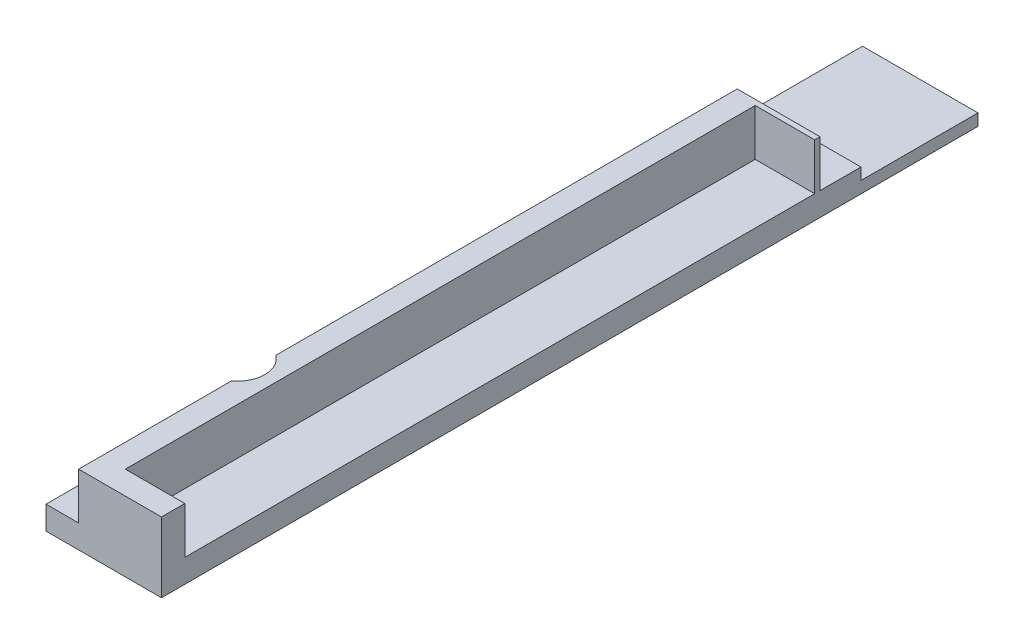
ISO-10303-21;
HEADER;
FILE_DESCRIPTION(('STEP AP214'),'2;1');
FILE_NAME('part.step','',(''),(''),'','','');
FILE_SCHEMA(('AUTOMOTIVE_DESIGN { 1 0 10303 214 1 1 1 1 }'));
ENDSEC;
DATA;
#1=APPLICATION_CONTEXT('core data for automotive mechanical design processes');
#2=APPLICATION_PROTOCOL_DEFINITION('international standard','automotive_design',2000,#1);
#3=PRODUCT_CONTEXT('',#1,'mechanical');
#4=PRODUCT('Part','Part','',(#3));
#5=PRODUCT_RELATED_PRODUCT_CATEGORY('part','',(#4));
#6=PRODUCT_DEFINITION_FORMATION('','',#4);
#7=PRODUCT_DEFINITION_CONTEXT('part definition',#1,'design');
#8=PRODUCT_DEFINITION('design','',#6,#7);
#9=PRODUCT_DEFINITION_SHAPE('','',#8);
#10=(LENGTH_UNIT() NAMED_UNIT(*) SI_UNIT(.MILLI.,.METRE.));
#11=(NAMED_UNIT(*) PLANE_ANGLE_UNIT() SI_UNIT($,.RADIAN.));
#12=(NAMED_UNIT(*) SI_UNIT($,.STERADIAN.) SOLID_ANGLE_UNIT());
#13=UNCERTAINTY_MEASURE_WITH_UNIT(LENGTH_MEASURE(1.E-05),#10,'distance_accuracy_value','');
#14=(GEOMETRIC_REPRESENTATION_CONTEXT(3) GLOBAL_UNCERTAINTY_ASSIGNED_CONTEXT((#13)) GLOBAL_UNIT_ASSIGNED_CONTEXT((#10,
#11,#12)) REPRESENTATION_CONTEXT('',''));
#15=CARTESIAN_POINT('',(0.,0.,0.));
#16=DIRECTION('',(0.,0.,1.));
#17=DIRECTION('',(1.,0.,0.));
#18=AXIS2_PLACEMENT_3D('',#15,#16,#17);
#19=CARTESIAN_POINT('',(-38.481,15.24,0.));
#20=DIRECTION('',(-1.,0.,0.));
#21=DIRECTION('',(0.,0.,1.));
#22=AXIS2_PLACEMENT_3D('',#19,#20,#21);
#23=PLANE('',#22);
#24=DIRECTION('',(0.,0.,-1.));
#25=VECTOR('',#24,1.);
#26=CARTESIAN_POINT('',(-38.481,5.08,0.));
#27=LINE('',#26,#25);
#28=CARTESIAN_POINT('',(-38.481,5.08,80.7048732037143));
#29=VERTEX_POINT('',#28);
#30=CARTESIAN_POINT('',(-38.481,5.08,-19.7685976203883));
#31=VERTEX_POINT('',#30);
#32=EDGE_CURVE('E187',#29,#31,#27,.T.);
#33=ORIENTED_EDGE('',*,*,#32,.F.);
#34=DIRECTION('',(0.,-1.,0.));
#35=VECTOR('',#34,1.);
#36=CARTESIAN_POINT('',(-38.481,21.59,80.7048732037143));
#37=LINE('',#36,#35);
#38=CARTESIAN_POINT('',(-38.481,15.24,80.7048732037143));
#39=VERTEX_POINT('',#38);
#40=EDGE_CURVE('E164',#29,#39,#37,.F.);
#41=ORIENTED_EDGE('',*,*,#40,.T.);
#42=DIRECTION('',(0.,0.,-1.));
#43=VECTOR('',#42,1.);
#44=CARTESIAN_POINT('',(-38.481,15.24,0.));
#45=LINE('',#44,#43);
#46=CARTESIAN_POINT('',(-38.481,15.24,-19.7685976203883));
#47=VERTEX_POINT('',#46);
#48=EDGE_CURVE('E210',#39,#47,#45,.T.);
#49=ORIENTED_EDGE('',*,*,#48,.T.);
#50=DIRECTION('',(0.,-1.,0.));
#51=VECTOR('',#50,1.);
#52=CARTESIAN_POINT('',(-38.481,15.24,-19.7685976203883));
#53=LINE('',#52,#51);
#54=EDGE_CURVE('E211',#47,#31,#53,.T.);
#55=ORIENTED_EDGE('',*,*,#54,.T.);
#56=EDGE_LOOP('',(#33,#41,#49,#55));
#57=FACE_BOUND('',#56,.T.);
#58=ADVANCED_FACE('F56',(#57),#23,.T.);
#59=CARTESIAN_POINT('',(-38.481,15.24,123.637560240964));
#60=VERTEX_POINT('',#59);
#61=CARTESIAN_POINT('',(-38.481,15.24,90.3702472782134));
#62=VERTEX_POINT('',#61);
#63=EDGE_CURVE('E177',#60,#62,#45,.T.);
#64=ORIENTED_EDGE('',*,*,#63,.T.);
#65=DIRECTION('',(0.,-1.,0.));
#66=VECTOR('',#65,1.);
#67=CARTESIAN_POINT('',(-38.481,21.59,90.3702472782134));
#68=LINE('',#67,#66);
#69=CARTESIAN_POINT('',(-38.481,5.08,90.3702472782134));
#70=VERTEX_POINT('',#69);
#71=EDGE_CURVE('E72',#62,#70,#68,.T.);
#72=ORIENTED_EDGE('',*,*,#71,.T.);
#73=CARTESIAN_POINT('',(-38.481,5.08,123.637560240964));
#74=VERTEX_POINT('',#73);
#75=EDGE_CURVE('E175',#74,#70,#27,.T.);
#76=ORIENTED_EDGE('',*,*,#75,.F.);
#77=DIRECTION('',(0.,-1.,0.));
#78=VECTOR('',#77,1.);
#79=CARTESIAN_POINT('',(-38.481,15.24,123.637560240964));
#80=LINE('',#79,#78);
#81=EDGE_CURVE('E235',#60,#74,#80,.T.);
#82=ORIENTED_EDGE('',*,*,#81,.F.);
#83=EDGE_LOOP('',(#64,#72,#76,#82));
#84=FACE_BOUND('',#83,.T.);
#85=ADVANCED_FACE('F174',(#84),#23,.T.);
#86=CARTESIAN_POINT('',(-20.447,5.08,-54.1624397590361));
#87=DIRECTION('',(0.,0.,1.));
#88=DIRECTION('',(1.,0.,0.));
#89=AXIS2_PLACEMENT_3D('',#86,#87,#88);
#90=PLANE('',#89);
#91=DIRECTION('',(-1.,0.,0.));
#92=VECTOR('',#91,1.);
#93=CARTESIAN_POINT('',(-45.593,2.54,-54.1624397590361));
#94=LINE('',#93,#92);
#95=CARTESIAN_POINT('',(-20.447,2.54,-54.1624397590361));
#96=VERTEX_POINT('',#95);
#97=CARTESIAN_POINT('',(-45.593,2.54,-54.1624397590361));
#98=VERTEX_POINT('',#97);
#99=EDGE_CURVE('E281',#96,#98,#94,.T.);
#100=ORIENTED_EDGE('',*,*,#99,.F.);
#101=DIRECTION('',(0.,-1.,0.));
#102=VECTOR('',#101,1.);
#103=CARTESIAN_POINT('',(-20.447,5.08,-54.1624397590361));
#104=LINE('',#103,#102);
#105=CARTESIAN_POINT('',(-20.447,0.,-54.1624397590361));
#106=VERTEX_POINT('',#105);
#107=EDGE_CURVE('E65',#96,#106,#104,.T.);
#108=ORIENTED_EDGE('',*,*,#107,.T.);
#109=DIRECTION('',(-1.,0.,0.));
#110=VECTOR('',#109,1.);
#111=CARTESIAN_POINT('',(-20.447,0.,-54.1624397590361));
#112=LINE('',#111,#110);
#113=CARTESIAN_POINT('',(-45.593,0.,-54.1624397590361));
#114=VERTEX_POINT('',#113);
#115=EDGE_CURVE('E254',#106,#114,#112,.T.);
#116=ORIENTED_EDGE('',*,*,#115,.T.);
#117=DIRECTION('',(0.,-1.,0.));
#118=VECTOR('',#117,1.);
#119=CARTESIAN_POINT('',(-45.593,5.08,-54.1624397590361));
#120=LINE('',#119,#118);
#121=EDGE_CURVE('E270',#98,#114,#120,.T.);
#122=ORIENTED_EDGE('',*,*,#121,.F.);
#123=EDGE_LOOP('',(#100,#108,#116,#122));
#124=FACE_BOUND('',#123,.T.);
#125=ADVANCED_FACE('F278',(#124),#90,.F.);
#126=CARTESIAN_POINT('',(0.,5.08,0.));
#127=DIRECTION('',(0.,-1.,0.));
#128=DIRECTION('',(0.,0.,-1.));
#129=AXIS2_PLACEMENT_3D('',#126,#127,#128);
#130=PLANE('',#129);
#131=DIRECTION('',(1.,0.,0.));
#132=VECTOR('',#131,1.);
#133=CARTESIAN_POINT('',(0.,5.08,-18.6024397590361));
#134=LINE('',#133,#132);
#135=CARTESIAN_POINT('',(-33.401,5.08,-18.6024397590361));
#136=VERTEX_POINT('',#135);
#137=CARTESIAN_POINT('',(-20.447,5.08,-18.6024397590361));
#138=VERTEX_POINT('',#137);
#139=EDGE_CURVE('E203',#136,#138,#134,.T.);
#140=ORIENTED_EDGE('',*,*,#139,.F.);
#141=DIRECTION('',(0.,0.,-1.));
#142=VECTOR('',#141,1.);
#143=CARTESIAN_POINT('',(-33.401,5.08,0.));
#144=LINE('',#143,#142);
#145=CARTESIAN_POINT('',(-33.401,5.08,118.557560240964));
#146=VERTEX_POINT('',#145);
#147=EDGE_CURVE('E193',#146,#136,#144,.T.);
#148=ORIENTED_EDGE('',*,*,#147,.F.);
#149=DIRECTION('',(-1.,0.,0.));
#150=VECTOR('',#149,1.);
#151=CARTESIAN_POINT('',(0.,5.08,118.557560240964));
#152=LINE('',#151,#150);
#153=CARTESIAN_POINT('',(-20.447,5.08,118.557560240964));
#154=VERTEX_POINT('',#153);
#155=EDGE_CURVE('E186',#154,#146,#152,.T.);
#156=ORIENTED_EDGE('',*,*,#155,.F.);
#157=DIRECTION('',(0.,0.,-1.));
#158=VECTOR('',#157,1.);
#159=CARTESIAN_POINT('',(-20.447,5.08,-54.1624397590361));
#160=LINE('',#159,#158);
#161=EDGE_CURVE('E243',#154,#138,#160,.T.);
#162=ORIENTED_EDGE('',*,*,#161,.T.);
#163=EDGE_LOOP('',(#140,#148,#156,#162));
#164=FACE_BOUND('',#163,.T.);
#165=ADVANCED_FACE('F424',(#164),#130,.F.);
#166=CARTESIAN_POINT('',(-20.447,5.08,-54.1624397590361));
#167=DIRECTION('',(-1.,0.,0.));
#168=DIRECTION('',(0.,0.,1.));
#169=AXIS2_PLACEMENT_3D('',#166,#167,#168);
#170=PLANE('',#169);
#171=DIRECTION('',(0.,0.,-1.));
#172=VECTOR('',#171,1.);
#173=CARTESIAN_POINT('',(-20.447,2.54,-54.1624397590361));
#174=LINE('',#173,#172);
#175=CARTESIAN_POINT('',(-20.447,2.54,-28.676603854416));
#176=VERTEX_POINT('',#175);
#177=EDGE_CURVE('E361',#176,#96,#174,.T.);
#178=ORIENTED_EDGE('',*,*,#177,.F.);
#179=DIRECTION('',(0.,1.,0.));
#180=VECTOR('',#179,1.);
#181=CARTESIAN_POINT('',(-20.447,2.54,-28.676603854416));
#182=LINE('',#181,#180);
#183=CARTESIAN_POINT('',(-20.447,5.08,-28.676603854416));
#184=VERTEX_POINT('',#183);
#185=EDGE_CURVE('E195',#176,#184,#182,.T.);
#186=ORIENTED_EDGE('',*,*,#185,.T.);
#187=CARTESIAN_POINT('',(-20.447,5.08,-19.7685976203883));
#188=VERTEX_POINT('',#187);
#189=EDGE_CURVE('E239',#188,#184,#160,.T.);
#190=ORIENTED_EDGE('',*,*,#189,.F.);
#191=DIRECTION('',(0.,-1.,0.));
#192=VECTOR('',#191,1.);
#193=CARTESIAN_POINT('',(-20.447,15.24,-19.7685976203883));
#194=LINE('',#193,#192);
#195=CARTESIAN_POINT('',(-20.447,15.24,-19.7685976203883));
#196=VERTEX_POINT('',#195);
#197=EDGE_CURVE('E215',#196,#188,#194,.T.);
#198=ORIENTED_EDGE('',*,*,#197,.F.);
#199=DIRECTION('',(0.,0.,-1.));
#200=VECTOR('',#199,1.);
#201=CARTESIAN_POINT('',(-20.447,15.24,0.));
#202=LINE('',#201,#200);
#203=CARTESIAN_POINT('',(-20.447,15.24,-18.6024397590361));
#204=VERTEX_POINT('',#203);
#205=EDGE_CURVE('E316',#204,#196,#202,.T.);
#206=ORIENTED_EDGE('',*,*,#205,.F.);
#207=DIRECTION('',(0.,-1.,0.));
#208=VECTOR('',#207,1.);
#209=CARTESIAN_POINT('',(-20.447,15.24,-18.6024397590361));
#210=LINE('',#209,#208);
#211=EDGE_CURVE('E219',#204,#138,#210,.T.);
#212=ORIENTED_EDGE('',*,*,#211,.T.);
#213=ORIENTED_EDGE('',*,*,#161,.F.);
#214=DIRECTION('',(0.,-1.,0.));
#215=VECTOR('',#214,1.);
#216=CARTESIAN_POINT('',(-20.447,15.24,118.557560240964));
#217=LINE('',#216,#215);
#218=CARTESIAN_POINT('',(-20.447,15.24,118.557560240964));
#219=VERTEX_POINT('',#218);
#220=EDGE_CURVE('E231',#219,#154,#217,.T.);
#221=ORIENTED_EDGE('',*,*,#220,.F.);
#222=DIRECTION('',(0.,0.,-1.));
#223=VECTOR('',#222,1.);
#224=CARTESIAN_POINT('',(-20.447,15.24,0.));
#225=LINE('',#224,#223);
#226=CARTESIAN_POINT('',(-20.447,15.24,123.637560240964));
#227=VERTEX_POINT('',#226);
#228=EDGE_CURVE('E290',#227,#219,#225,.T.);
#229=ORIENTED_EDGE('',*,*,#228,.F.);
#230=DIRECTION('',(0.,-1.,0.));
#231=VECTOR('',#230,1.);
#232=CARTESIAN_POINT('',(-20.447,5.08,123.637560240964));
#233=LINE('',#232,#231);
#234=CARTESIAN_POINT('',(-20.447,0.,123.637560240964));
#235=VERTEX_POINT('',#234);
#236=EDGE_CURVE('E250',#227,#235,#233,.T.);
#237=ORIENTED_EDGE('',*,*,#236,.T.);
#238=DIRECTION('',(0.,0.,-1.));
#239=VECTOR('',#238,1.);
#240=CARTESIAN_POINT('',(-20.447,0.,-54.1624397590361));
#241=LINE('',#240,#239);
#242=EDGE_CURVE('E238',#235,#106,#241,.T.);
#243=ORIENTED_EDGE('',*,*,#242,.T.);
#244=ORIENTED_EDGE('',*,*,#107,.F.);
#245=EDGE_LOOP('',(#178,#186,#190,#198,#206,#212,#213,#221,#229,#237,#243,#244));
#246=FACE_BOUND('',#245,.T.);
#247=ADVANCED_FACE('F58',(#246),#170,.F.);
#248=CARTESIAN_POINT('',(-45.593,5.08,-54.1624397590361));
#249=DIRECTION('',(1.,0.,0.));
#250=DIRECTION('',(0.,0.,-1.));
#251=AXIS2_PLACEMENT_3D('',#248,#249,#250);
#252=PLANE('',#251);
#253=DIRECTION('',(0.,0.,1.));
#254=VECTOR('',#253,1.);
#255=CARTESIAN_POINT('',(-45.593,5.08,-54.1624397590361));
#256=LINE('',#255,#254);
#257=CARTESIAN_POINT('',(-45.593,5.08,-28.676603854416));
#258=VERTEX_POINT('',#257);
#259=CARTESIAN_POINT('',(-45.593,5.08,123.637560240964));
#260=VERTEX_POINT('',#259);
#261=EDGE_CURVE('E245',#258,#260,#256,.T.);
#262=ORIENTED_EDGE('',*,*,#261,.F.);
#263=DIRECTION('',(0.,1.,0.));
#264=VECTOR('',#263,1.);
#265=CARTESIAN_POINT('',(-45.593,2.54,-28.676603854416));
#266=LINE('',#265,#264);
#267=CARTESIAN_POINT('',(-45.593,2.54,-28.676603854416));
#268=VERTEX_POINT('',#267);
#269=EDGE_CURVE('E79',#268,#258,#266,.T.);
#270=ORIENTED_EDGE('',*,*,#269,.F.);
#271=DIRECTION('',(0.,0.,1.));
#272=VECTOR('',#271,1.);
#273=CARTESIAN_POINT('',(-45.593,2.54,-54.1624397590361));
#274=LINE('',#273,#272);
#275=EDGE_CURVE('E352',#98,#268,#274,.T.);
#276=ORIENTED_EDGE('',*,*,#275,.F.);
#277=ORIENTED_EDGE('',*,*,#121,.T.);
#278=DIRECTION('',(0.,0.,1.));
#279=VECTOR('',#278,1.);
#280=CARTESIAN_POINT('',(-45.593,0.,-54.1624397590361));
#281=LINE('',#280,#279);
#282=CARTESIAN_POINT('',(-45.593,0.,123.637560240964));
#283=VERTEX_POINT('',#282);
#284=EDGE_CURVE('E258',#114,#283,#281,.T.);
#285=ORIENTED_EDGE('',*,*,#284,.T.);
#286=DIRECTION('',(0.,-1.,0.));
#287=VECTOR('',#286,1.);
#288=CARTESIAN_POINT('',(-45.593,5.08,123.637560240964));
#289=LINE('',#288,#287);
#290=EDGE_CURVE('E266',#260,#283,#289,.T.);
#291=ORIENTED_EDGE('',*,*,#290,.F.);
#292=EDGE_LOOP('',(#262,#270,#276,#277,#285,#291));
#293=FACE_BOUND('',#292,.T.);
#294=ADVANCED_FACE('F430',(#293),#252,.F.);
#295=CARTESIAN_POINT('',(-20.447,5.08,123.637560240964));
#296=DIRECTION('',(0.,0.,-1.));
#297=DIRECTION('',(-1.,0.,0.));
#298=AXIS2_PLACEMENT_3D('',#295,#296,#297);
#299=PLANE('',#298);
#300=DIRECTION('',(1.,0.,0.));
#301=VECTOR('',#300,1.);
#302=CARTESIAN_POINT('',(-20.447,0.,123.637560240964));
#303=LINE('',#302,#301);
#304=EDGE_CURVE('E244',#283,#235,#303,.T.);
#305=ORIENTED_EDGE('',*,*,#304,.T.);
#306=ORIENTED_EDGE('',*,*,#236,.F.);
#307=DIRECTION('',(1.,0.,0.));
#308=VECTOR('',#307,1.);
#309=CARTESIAN_POINT('',(0.,15.24,123.637560240964));
#310=LINE('',#309,#308);
#311=EDGE_CURVE('E295',#60,#227,#310,.T.);
#312=ORIENTED_EDGE('',*,*,#311,.F.);
#313=ORIENTED_EDGE('',*,*,#81,.T.);
#314=DIRECTION('',(1.,0.,0.));
#315=VECTOR('',#314,1.);
#316=CARTESIAN_POINT('',(-20.447,5.08,123.637560240964));
#317=LINE('',#316,#315);
#318=EDGE_CURVE('E183',#260,#74,#317,.T.);
#319=ORIENTED_EDGE('',*,*,#318,.F.);
#320=ORIENTED_EDGE('',*,*,#290,.T.);
#321=EDGE_LOOP('',(#305,#306,#312,#313,#319,#320));
#322=FACE_BOUND('',#321,.T.);
#323=ADVANCED_FACE('F294',(#322),#299,.F.);
#324=CARTESIAN_POINT('',(-42.037,5.08,85.5375602409639));
#325=DIRECTION('',(0.,1.,0.));
#326=DIRECTION('',(0.,0.,1.));
#327=AXIS2_PLACEMENT_3D('',#324,#325,#326);
#328=CIRCLE('',#327,3.);
#329=CARTESIAN_POINT('',(-42.037,5.08,88.5375602409639));
#330=VERTEX_POINT('',#329);
#331=EDGE_CURVE('E390',#330,#330,#328,.T.);
#332=ORIENTED_EDGE('',*,*,#331,.F.);
#333=EDGE_LOOP('',(#332));
#334=FACE_BOUND('',#333,.T.);
#335=ORIENTED_EDGE('',*,*,#261,.T.);
#336=ORIENTED_EDGE('',*,*,#318,.T.);
#337=ORIENTED_EDGE('',*,*,#75,.T.);
#338=CARTESIAN_POINT('',(-42.037,5.08,85.5375602409639));
#339=DIRECTION('',(0.,1.,0.));
#340=DIRECTION('',(0.,0.,1.));
#341=AXIS2_PLACEMENT_3D('',#338,#339,#340);
#342=CIRCLE('',#341,6.);
#343=EDGE_CURVE('E161',#70,#29,#342,.T.);
#344=ORIENTED_EDGE('',*,*,#343,.T.);
#345=ORIENTED_EDGE('',*,*,#32,.T.);
#346=DIRECTION('',(1.,0.,0.));
#347=VECTOR('',#346,1.);
#348=CARTESIAN_POINT('',(0.,5.08,-19.7685976203883));
#349=LINE('',#348,#347);
#350=EDGE_CURVE('E207',#31,#188,#349,.T.);
#351=ORIENTED_EDGE('',*,*,#350,.T.);
#352=ORIENTED_EDGE('',*,*,#189,.T.);
#353=DIRECTION('',(1.,0.,0.));
#354=VECTOR('',#353,1.);
#355=CARTESIAN_POINT('',(-45.593,5.08,-28.676603854416));
#356=LINE('',#355,#354);
#357=EDGE_CURVE('E349',#258,#184,#356,.T.);
#358=ORIENTED_EDGE('',*,*,#357,.F.);
#359=EDGE_LOOP('',(#335,#336,#337,#344,#345,#351,#352,#358));
#360=FACE_BOUND('',#359,.T.);
#361=CARTESIAN_POINT('',(-33.02,5.08,-24.2226007374022));
#362=DIRECTION('',(0.,1.,0.));
#363=DIRECTION('',(0.,0.,1.));
#364=AXIS2_PLACEMENT_3D('',#361,#362,#363);
#365=CIRCLE('',#364,3.);
#366=CARTESIAN_POINT('',(-33.02,5.08,-21.2226007374022));
#367=VERTEX_POINT('',#366);
#368=EDGE_CURVE('E381',#367,#367,#365,.T.);
#369=ORIENTED_EDGE('',*,*,#368,.F.);
#370=EDGE_LOOP('',(#369));
#371=FACE_BOUND('',#370,.T.);
#372=ADVANCED_FACE('F180',(#334,#360,#371),#130,.F.);
#373=CARTESIAN_POINT('',(0.,0.,0.));
#374=DIRECTION('',(0.,-1.,0.));
#375=DIRECTION('',(0.,0.,-1.));
#376=AXIS2_PLACEMENT_3D('',#373,#374,#375);
#377=PLANE('',#376);
#378=CARTESIAN_POINT('',(-42.037,0.,85.5375602409639));
#379=DIRECTION('',(0.,1.,0.));
#380=DIRECTION('',(0.,0.,1.));
#381=AXIS2_PLACEMENT_3D('',#378,#379,#380);
#382=CIRCLE('',#381,3.);
#383=CARTESIAN_POINT('',(-42.037,0.,88.5375602409639));
#384=VERTEX_POINT('',#383);
#385=EDGE_CURVE('E169',#384,#384,#382,.T.);
#386=ORIENTED_EDGE('',*,*,#385,.T.);
#387=EDGE_LOOP('',(#386));
#388=FACE_BOUND('',#387,.T.);
#389=CARTESIAN_POINT('',(-33.02,0.,-24.2226007374022));
#390=DIRECTION('',(0.,1.,0.));
#391=DIRECTION('',(0.,0.,1.));
#392=AXIS2_PLACEMENT_3D('',#389,#390,#391);
#393=CIRCLE('',#392,3.);
#394=CARTESIAN_POINT('',(-33.02,0.,-21.2226007374022));
#395=VERTEX_POINT('',#394);
#396=EDGE_CURVE('E353',#395,#395,#393,.T.);
#397=ORIENTED_EDGE('',*,*,#396,.T.);
#398=EDGE_LOOP('',(#397));
#399=FACE_BOUND('',#398,.T.);
#400=ORIENTED_EDGE('',*,*,#242,.F.);
#401=ORIENTED_EDGE('',*,*,#304,.F.);
#402=ORIENTED_EDGE('',*,*,#284,.F.);
#403=ORIENTED_EDGE('',*,*,#115,.F.);
#404=EDGE_LOOP('',(#400,#401,#402,#403));
#405=FACE_BOUND('',#404,.T.);
#406=ADVANCED_FACE('F286',(#388,#399,#405),#377,.T.);
#407=CARTESIAN_POINT('',(0.,15.24,118.557560240964));
#408=DIRECTION('',(0.,0.,1.));
#409=DIRECTION('',(1.,0.,0.));
#410=AXIS2_PLACEMENT_3D('',#407,#408,#409);
#411=PLANE('',#410);
#412=ORIENTED_EDGE('',*,*,#155,.T.);
#413=DIRECTION('',(0.,-1.,0.));
#414=VECTOR('',#413,1.);
#415=CARTESIAN_POINT('',(-33.401,15.24,118.557560240964));
#416=LINE('',#415,#414);
#417=CARTESIAN_POINT('',(-33.401,15.24,118.557560240964));
#418=VERTEX_POINT('',#417);
#419=EDGE_CURVE('E227',#418,#146,#416,.T.);
#420=ORIENTED_EDGE('',*,*,#419,.F.);
#421=DIRECTION('',(-1.,0.,0.));
#422=VECTOR('',#421,1.);
#423=CARTESIAN_POINT('',(0.,15.24,118.557560240964));
#424=LINE('',#423,#422);
#425=EDGE_CURVE('E304',#219,#418,#424,.T.);
#426=ORIENTED_EDGE('',*,*,#425,.F.);
#427=ORIENTED_EDGE('',*,*,#220,.T.);
#428=EDGE_LOOP('',(#412,#420,#426,#427));
#429=FACE_BOUND('',#428,.T.);
#430=ADVANCED_FACE('F419',(#429),#411,.F.);
#431=CARTESIAN_POINT('',(-33.401,15.24,0.));
#432=DIRECTION('',(-1.,0.,0.));
#433=DIRECTION('',(0.,0.,1.));
#434=AXIS2_PLACEMENT_3D('',#431,#432,#433);
#435=PLANE('',#434);
#436=ORIENTED_EDGE('',*,*,#147,.T.);
#437=DIRECTION('',(0.,-1.,0.));
#438=VECTOR('',#437,1.);
#439=CARTESIAN_POINT('',(-33.401,15.24,-18.6024397590361));
#440=LINE('',#439,#438);
#441=CARTESIAN_POINT('',(-33.401,15.24,-18.6024397590361));
#442=VERTEX_POINT('',#441);
#443=EDGE_CURVE('E223',#442,#136,#440,.T.);
#444=ORIENTED_EDGE('',*,*,#443,.F.);
#445=DIRECTION('',(0.,0.,-1.));
#446=VECTOR('',#445,1.);
#447=CARTESIAN_POINT('',(-33.401,15.24,0.));
#448=LINE('',#447,#446);
#449=EDGE_CURVE('E311',#418,#442,#448,.T.);
#450=ORIENTED_EDGE('',*,*,#449,.F.);
#451=ORIENTED_EDGE('',*,*,#419,.T.);
#452=EDGE_LOOP('',(#436,#444,#450,#451));
#453=FACE_BOUND('',#452,.T.);
#454=ADVANCED_FACE('F444',(#453),#435,.F.);
#455=CARTESIAN_POINT('',(0.,15.24,-18.6024397590361));
#456=DIRECTION('',(0.,0.,-1.));
#457=DIRECTION('',(-1.,0.,0.));
#458=AXIS2_PLACEMENT_3D('',#455,#456,#457);
#459=PLANE('',#458);
#460=ORIENTED_EDGE('',*,*,#139,.T.);
#461=ORIENTED_EDGE('',*,*,#211,.F.);
#462=DIRECTION('',(1.,0.,0.));
#463=VECTOR('',#462,1.);
#464=CARTESIAN_POINT('',(0.,15.24,-18.6024397590361));
#465=LINE('',#464,#463);
#466=EDGE_CURVE('E314',#442,#204,#465,.T.);
#467=ORIENTED_EDGE('',*,*,#466,.F.);
#468=ORIENTED_EDGE('',*,*,#443,.T.);
#469=EDGE_LOOP('',(#460,#461,#467,#468));
#470=FACE_BOUND('',#469,.T.);
#471=ADVANCED_FACE('F448',(#470),#459,.F.);
#472=CARTESIAN_POINT('',(0.,15.24,-19.7685976203883));
#473=DIRECTION('',(0.,0.,-1.));
#474=DIRECTION('',(-1.,0.,0.));
#475=AXIS2_PLACEMENT_3D('',#472,#473,#474);
#476=PLANE('',#475);
#477=ORIENTED_EDGE('',*,*,#350,.F.);
#478=ORIENTED_EDGE('',*,*,#54,.F.);
#479=DIRECTION('',(1.,0.,0.));
#480=VECTOR('',#479,1.);
#481=CARTESIAN_POINT('',(0.,15.24,-19.7685976203883));
#482=LINE('',#481,#480);
#483=EDGE_CURVE('E197',#47,#196,#482,.T.);
#484=ORIENTED_EDGE('',*,*,#483,.T.);
#485=ORIENTED_EDGE('',*,*,#197,.T.);
#486=EDGE_LOOP('',(#477,#478,#484,#485));
#487=FACE_BOUND('',#486,.T.);
#488=ADVANCED_FACE('F328',(#487),#476,.T.);
#489=CARTESIAN_POINT('',(0.,15.24,0.));
#490=DIRECTION('',(0.,1.,0.));
#491=DIRECTION('',(0.,0.,1.));
#492=AXIS2_PLACEMENT_3D('',#489,#490,#491);
#493=PLANE('',#492);
#494=ORIENTED_EDGE('',*,*,#48,.F.);
#495=CARTESIAN_POINT('',(-42.037,15.24,85.5375602409639));
#496=DIRECTION('',(0.,1.,0.));
#497=DIRECTION('',(0.,0.,1.));
#498=AXIS2_PLACEMENT_3D('',#495,#496,#497);
#499=CIRCLE('',#498,6.);
#500=EDGE_CURVE('E12',#39,#62,#499,.F.);
#501=ORIENTED_EDGE('',*,*,#500,.T.);
#502=ORIENTED_EDGE('',*,*,#63,.F.);
#503=ORIENTED_EDGE('',*,*,#311,.T.);
#504=ORIENTED_EDGE('',*,*,#228,.T.);
#505=ORIENTED_EDGE('',*,*,#425,.T.);
#506=ORIENTED_EDGE('',*,*,#449,.T.);
#507=ORIENTED_EDGE('',*,*,#466,.T.);
#508=ORIENTED_EDGE('',*,*,#205,.T.);
#509=ORIENTED_EDGE('',*,*,#483,.F.);
#510=EDGE_LOOP('',(#494,#501,#502,#503,#504,#505,#506,#507,#508,#509));
#511=FACE_BOUND('',#510,.T.);
#512=ADVANCED_FACE('F298',(#511),#493,.T.);
#513=CARTESIAN_POINT('',(-45.593,2.54,-28.676603854416));
#514=DIRECTION('',(0.,0.,1.));
#515=DIRECTION('',(1.,0.,0.));
#516=AXIS2_PLACEMENT_3D('',#513,#514,#515);
#517=PLANE('',#516);
#518=ORIENTED_EDGE('',*,*,#357,.T.);
#519=ORIENTED_EDGE('',*,*,#185,.F.);
#520=DIRECTION('',(1.,0.,0.));
#521=VECTOR('',#520,1.);
#522=CARTESIAN_POINT('',(-45.593,2.54,-28.676603854416));
#523=LINE('',#522,#521);
#524=EDGE_CURVE('E374',#268,#176,#523,.T.);
#525=ORIENTED_EDGE('',*,*,#524,.F.);
#526=ORIENTED_EDGE('',*,*,#269,.T.);
#527=EDGE_LOOP('',(#518,#519,#525,#526));
#528=FACE_BOUND('',#527,.T.);
#529=ADVANCED_FACE('F463',(#528),#517,.F.);
#530=CARTESIAN_POINT('',(0.,2.54,0.));
#531=DIRECTION('',(0.,1.,0.));
#532=DIRECTION('',(0.,0.,1.));
#533=AXIS2_PLACEMENT_3D('',#530,#531,#532);
#534=PLANE('',#533);
#535=ORIENTED_EDGE('',*,*,#275,.T.);
#536=ORIENTED_EDGE('',*,*,#524,.T.);
#537=ORIENTED_EDGE('',*,*,#177,.T.);
#538=ORIENTED_EDGE('',*,*,#99,.T.);
#539=EDGE_LOOP('',(#535,#536,#537,#538));
#540=FACE_BOUND('',#539,.T.);
#541=ADVANCED_FACE('F466',(#540),#534,.T.);
#542=CARTESIAN_POINT('',(-33.02,0.,-24.2226007374022));
#543=DIRECTION('',(0.,1.,0.));
#544=DIRECTION('',(0.,0.,1.));
#545=AXIS2_PLACEMENT_3D('',#542,#543,#544);
#546=CYLINDRICAL_SURFACE('',#545,3.);
#547=ORIENTED_EDGE('',*,*,#396,.F.);
#548=EDGE_LOOP('',(#547));
#549=FACE_BOUND('',#548,.T.);
#550=ORIENTED_EDGE('',*,*,#368,.T.);
#551=EDGE_LOOP('',(#550));
#552=FACE_BOUND('',#551,.T.);
#553=ADVANCED_FACE('F469',(#549,#552),#546,.F.);
#554=CARTESIAN_POINT('',(-42.037,21.59,85.5375602409639));
#555=DIRECTION('',(0.,-1.,0.));
#556=DIRECTION('',(0.,0.,-1.));
#557=AXIS2_PLACEMENT_3D('',#554,#555,#556);
#558=CYLINDRICAL_SURFACE('',#557,6.);
#559=ORIENTED_EDGE('',*,*,#343,.F.);
#560=ORIENTED_EDGE('',*,*,#71,.F.);
#561=ORIENTED_EDGE('',*,*,#500,.F.);
#562=ORIENTED_EDGE('',*,*,#40,.F.);
#563=EDGE_LOOP('',(#559,#560,#561,#562));
#564=FACE_BOUND('',#563,.T.);
#565=ADVANCED_FACE('F162',(#564),#558,.F.);
#566=CARTESIAN_POINT('',(-42.037,0.,85.5375602409639));
#567=DIRECTION('',(0.,1.,0.));
#568=DIRECTION('',(0.,0.,1.));
#569=AXIS2_PLACEMENT_3D('',#566,#567,#568);
#570=CYLINDRICAL_SURFACE('',#569,3.);
#571=ORIENTED_EDGE('',*,*,#385,.F.);
#572=EDGE_LOOP('',(#571));
#573=FACE_BOUND('',#572,.T.);
#574=ORIENTED_EDGE('',*,*,#331,.T.);
#575=EDGE_LOOP('',(#574));
#576=FACE_BOUND('',#575,.T.);
#577=ADVANCED_FACE('F476',(#573,#576),#570,.F.);
#578=CLOSED_SHELL('',(#58,#85,#125,#165,#247,#294,#323,#372,#406,#430,#454,#471,#488,#512,#529,
#541,#553,#565,#577));
#579=MANIFOLD_SOLID_BREP('B2',#578);
#580=ADVANCED_BREP_SHAPE_REPRESENTATION('',(#18,#579),#14);
#581=SHAPE_DEFINITION_REPRESENTATION(#9,#580);
ENDSEC;
END-ISO-10303-21;
